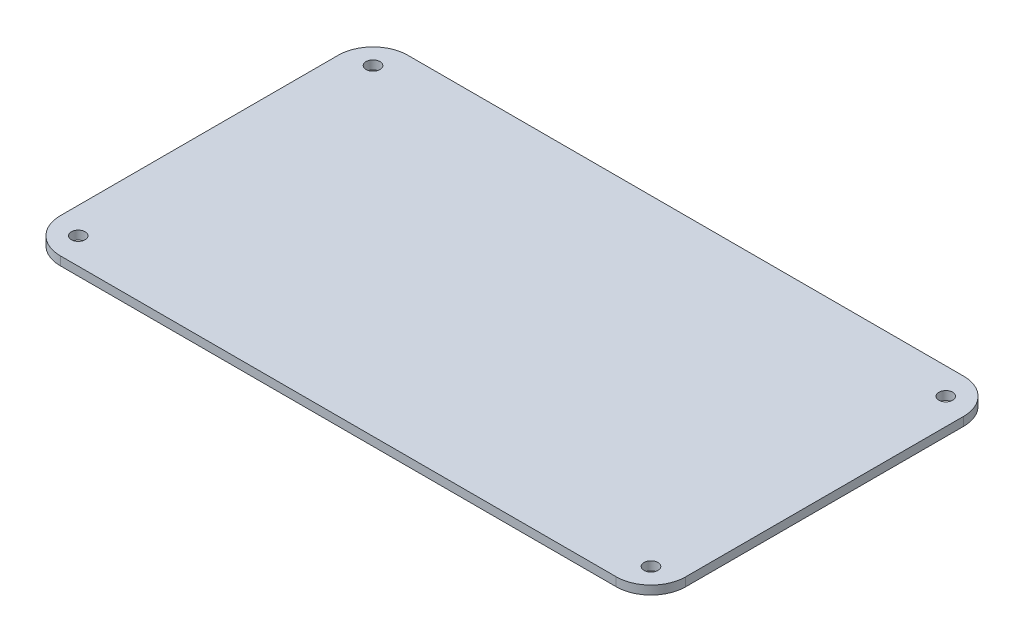
ISO-10303-21;
HEADER;
FILE_DESCRIPTION(('STEP AP214'),'2;1');
FILE_NAME('part.step','',(''),(''),'','','');
FILE_SCHEMA(('AUTOMOTIVE_DESIGN { 1 0 10303 214 1 1 1 1 }'));
ENDSEC;
DATA;
#1=APPLICATION_CONTEXT('core data for automotive mechanical design processes');
#2=APPLICATION_PROTOCOL_DEFINITION('international standard','automotive_design',2000,#1);
#3=PRODUCT_CONTEXT('',#1,'mechanical');
#4=PRODUCT('Part','Part','',(#3));
#5=PRODUCT_RELATED_PRODUCT_CATEGORY('part','',(#4));
#6=PRODUCT_DEFINITION_FORMATION('','',#4);
#7=PRODUCT_DEFINITION_CONTEXT('part definition',#1,'design');
#8=PRODUCT_DEFINITION('design','',#6,#7);
#9=PRODUCT_DEFINITION_SHAPE('','',#8);
#10=(LENGTH_UNIT() NAMED_UNIT(*) SI_UNIT(.MILLI.,.METRE.));
#11=(NAMED_UNIT(*) PLANE_ANGLE_UNIT() SI_UNIT($,.RADIAN.));
#12=(NAMED_UNIT(*) SI_UNIT($,.STERADIAN.) SOLID_ANGLE_UNIT());
#13=UNCERTAINTY_MEASURE_WITH_UNIT(LENGTH_MEASURE(1.E-05),#10,'distance_accuracy_value','');
#14=(GEOMETRIC_REPRESENTATION_CONTEXT(3) GLOBAL_UNCERTAINTY_ASSIGNED_CONTEXT((#13)) GLOBAL_UNIT_ASSIGNED_CONTEXT((#10,
#11,#12)) REPRESENTATION_CONTEXT('',''));
#15=CARTESIAN_POINT('',(0.,0.,0.));
#16=DIRECTION('',(0.,0.,1.));
#17=DIRECTION('',(1.,0.,0.));
#18=AXIS2_PLACEMENT_3D('',#15,#16,#17);
#19=CARTESIAN_POINT('',(-101.6,3.175,50.8));
#20=DIRECTION('',(0.,-1.,0.));
#21=DIRECTION('',(0.,0.,-1.));
#22=AXIS2_PLACEMENT_3D('',#19,#20,#21);
#23=PLANE('',#22);
#24=CARTESIAN_POINT('',(-101.6,3.175,50.8));
#25=DIRECTION('',(0.,1.,0.));
#26=DIRECTION('',(0.,0.,-1.));
#27=AXIS2_PLACEMENT_3D('',#24,#25,#26);
#28=CIRCLE('',#27,12.7);
#29=CARTESIAN_POINT('',(-114.3,3.175,50.7999999999999));
#30=VERTEX_POINT('',#29);
#31=CARTESIAN_POINT('',(-101.6,3.175,63.5));
#32=VERTEX_POINT('',#31);
#33=EDGE_CURVE('E145',#30,#32,#28,.T.);
#34=ORIENTED_EDGE('',*,*,#33,.T.);
#35=DIRECTION('',(1.,0.,0.));
#36=VECTOR('',#35,1.);
#37=CARTESIAN_POINT('',(101.6,3.175,63.5));
#38=LINE('',#37,#36);
#39=CARTESIAN_POINT('',(101.6,3.175,63.5));
#40=VERTEX_POINT('',#39);
#41=EDGE_CURVE('E93',#32,#40,#38,.T.);
#42=ORIENTED_EDGE('',*,*,#41,.T.);
#43=CARTESIAN_POINT('',(101.6,3.175,50.8));
#44=DIRECTION('',(0.,1.,0.));
#45=DIRECTION('',(0.,0.,1.));
#46=AXIS2_PLACEMENT_3D('',#43,#44,#45);
#47=CIRCLE('',#46,12.7);
#48=CARTESIAN_POINT('',(114.3,3.175,50.7999999999999));
#49=VERTEX_POINT('',#48);
#50=EDGE_CURVE('E160',#40,#49,#47,.T.);
#51=ORIENTED_EDGE('',*,*,#50,.T.);
#52=DIRECTION('',(0.,0.,-1.));
#53=VECTOR('',#52,1.);
#54=CARTESIAN_POINT('',(114.3,3.175,50.7999999999999));
#55=LINE('',#54,#53);
#56=CARTESIAN_POINT('',(114.3,3.175,-50.7999999999999));
#57=VERTEX_POINT('',#56);
#58=EDGE_CURVE('E173',#49,#57,#55,.T.);
#59=ORIENTED_EDGE('',*,*,#58,.T.);
#60=CARTESIAN_POINT('',(101.6,3.175,-50.8));
#61=DIRECTION('',(0.,1.,0.));
#62=DIRECTION('',(0.,0.,1.));
#63=AXIS2_PLACEMENT_3D('',#60,#61,#62);
#64=CIRCLE('',#63,12.7);
#65=CARTESIAN_POINT('',(101.6,3.175,-63.5));
#66=VERTEX_POINT('',#65);
#67=EDGE_CURVE('E112',#57,#66,#64,.T.);
#68=ORIENTED_EDGE('',*,*,#67,.T.);
#69=DIRECTION('',(-1.,0.,0.));
#70=VECTOR('',#69,1.);
#71=CARTESIAN_POINT('',(101.6,3.175,-63.5));
#72=LINE('',#71,#70);
#73=CARTESIAN_POINT('',(-101.6,3.175,-63.5));
#74=VERTEX_POINT('',#73);
#75=EDGE_CURVE('E106',#66,#74,#72,.T.);
#76=ORIENTED_EDGE('',*,*,#75,.T.);
#77=CARTESIAN_POINT('',(-101.6,3.175,-50.8));
#78=DIRECTION('',(0.,1.,0.));
#79=DIRECTION('',(0.,0.,1.));
#80=AXIS2_PLACEMENT_3D('',#77,#78,#79);
#81=CIRCLE('',#80,12.7);
#82=CARTESIAN_POINT('',(-114.3,3.175,-50.7999999999999));
#83=VERTEX_POINT('',#82);
#84=EDGE_CURVE('E110',#74,#83,#81,.T.);
#85=ORIENTED_EDGE('',*,*,#84,.T.);
#86=DIRECTION('',(0.,0.,1.));
#87=VECTOR('',#86,1.);
#88=CARTESIAN_POINT('',(-114.3,3.175,50.7999999999999));
#89=LINE('',#88,#87);
#90=EDGE_CURVE('E50',#83,#30,#89,.T.);
#91=ORIENTED_EDGE('',*,*,#90,.T.);
#92=EDGE_LOOP('',(#34,#42,#51,#59,#68,#76,#85,#91));
#93=FACE_BOUND('',#92,.T.);
#94=CARTESIAN_POINT('',(-104.6734,3.175,-53.8734));
#95=DIRECTION('',(0.,1.,0.));
#96=DIRECTION('',(0.,0.,1.));
#97=AXIS2_PLACEMENT_3D('',#94,#95,#96);
#98=CIRCLE('',#97,2.54);
#99=CARTESIAN_POINT('',(-104.6734,3.175,-51.3334));
#100=VERTEX_POINT('',#99);
#101=EDGE_CURVE('E134',#100,#100,#98,.T.);
#102=ORIENTED_EDGE('',*,*,#101,.F.);
#103=EDGE_LOOP('',(#102));
#104=FACE_BOUND('',#103,.T.);
#105=CARTESIAN_POINT('',(104.6734,3.175,-53.8734));
#106=DIRECTION('',(0.,1.,0.));
#107=DIRECTION('',(0.,0.,-1.));
#108=AXIS2_PLACEMENT_3D('',#105,#106,#107);
#109=CIRCLE('',#108,2.54);
#110=CARTESIAN_POINT('',(104.6734,3.175,-56.4134));
#111=VERTEX_POINT('',#110);
#112=EDGE_CURVE('E182',#111,#111,#109,.T.);
#113=ORIENTED_EDGE('',*,*,#112,.F.);
#114=EDGE_LOOP('',(#113));
#115=FACE_BOUND('',#114,.T.);
#116=CARTESIAN_POINT('',(104.6734,3.175,53.8734));
#117=DIRECTION('',(0.,1.,0.));
#118=DIRECTION('',(0.,0.,1.));
#119=AXIS2_PLACEMENT_3D('',#116,#117,#118);
#120=CIRCLE('',#119,2.54);
#121=CARTESIAN_POINT('',(104.6734,3.175,56.4134));
#122=VERTEX_POINT('',#121);
#123=EDGE_CURVE('E188',#122,#122,#120,.T.);
#124=ORIENTED_EDGE('',*,*,#123,.F.);
#125=EDGE_LOOP('',(#124));
#126=FACE_BOUND('',#125,.T.);
#127=CARTESIAN_POINT('',(-104.6734,3.175,53.8734));
#128=DIRECTION('',(0.,1.,0.));
#129=DIRECTION('',(0.,0.,-1.));
#130=AXIS2_PLACEMENT_3D('',#127,#128,#129);
#131=CIRCLE('',#130,2.54);
#132=CARTESIAN_POINT('',(-104.6734,3.175,51.3334));
#133=VERTEX_POINT('',#132);
#134=EDGE_CURVE('E194',#133,#133,#131,.T.);
#135=ORIENTED_EDGE('',*,*,#134,.F.);
#136=EDGE_LOOP('',(#135));
#137=FACE_BOUND('',#136,.T.);
#138=ADVANCED_FACE('F33',(#93,#104,#115,#126,#137),#23,.F.);
#139=CARTESIAN_POINT('',(-101.6,0.,50.8));
#140=DIRECTION('',(0.,-1.,0.));
#141=DIRECTION('',(0.,0.,-1.));
#142=AXIS2_PLACEMENT_3D('',#139,#140,#141);
#143=PLANE('',#142);
#144=CARTESIAN_POINT('',(104.6734,0.,53.8734));
#145=DIRECTION('',(0.,1.,0.));
#146=DIRECTION('',(0.,0.,1.));
#147=AXIS2_PLACEMENT_3D('',#144,#145,#146);
#148=CIRCLE('',#147,2.54);
#149=CARTESIAN_POINT('',(104.6734,0.,56.4134));
#150=VERTEX_POINT('',#149);
#151=EDGE_CURVE('E191',#150,#150,#148,.T.);
#152=ORIENTED_EDGE('',*,*,#151,.T.);
#153=EDGE_LOOP('',(#152));
#154=FACE_BOUND('',#153,.T.);
#155=CARTESIAN_POINT('',(-104.6734,0.,-53.8734));
#156=DIRECTION('',(0.,1.,0.));
#157=DIRECTION('',(0.,0.,1.));
#158=AXIS2_PLACEMENT_3D('',#155,#156,#157);
#159=CIRCLE('',#158,2.54);
#160=CARTESIAN_POINT('',(-104.6734,0.,-51.3334));
#161=VERTEX_POINT('',#160);
#162=EDGE_CURVE('E179',#161,#161,#159,.T.);
#163=ORIENTED_EDGE('',*,*,#162,.T.);
#164=EDGE_LOOP('',(#163));
#165=FACE_BOUND('',#164,.T.);
#166=CARTESIAN_POINT('',(-101.6,0.,50.8));
#167=DIRECTION('',(0.,1.,0.));
#168=DIRECTION('',(0.,0.,-1.));
#169=AXIS2_PLACEMENT_3D('',#166,#167,#168);
#170=CIRCLE('',#169,12.7);
#171=CARTESIAN_POINT('',(-114.3,0.,50.7999999999999));
#172=VERTEX_POINT('',#171);
#173=CARTESIAN_POINT('',(-101.6,0.,63.5));
#174=VERTEX_POINT('',#173);
#175=EDGE_CURVE('E130',#172,#174,#170,.T.);
#176=ORIENTED_EDGE('',*,*,#175,.F.);
#177=DIRECTION('',(0.,0.,1.));
#178=VECTOR('',#177,1.);
#179=CARTESIAN_POINT('',(-114.3,0.,50.7999999999999));
#180=LINE('',#179,#178);
#181=CARTESIAN_POINT('',(-114.3,0.,-50.7999999999999));
#182=VERTEX_POINT('',#181);
#183=EDGE_CURVE('E85',#182,#172,#180,.T.);
#184=ORIENTED_EDGE('',*,*,#183,.F.);
#185=CARTESIAN_POINT('',(-101.6,0.,-50.8));
#186=DIRECTION('',(0.,1.,0.));
#187=DIRECTION('',(0.,0.,1.));
#188=AXIS2_PLACEMENT_3D('',#185,#186,#187);
#189=CIRCLE('',#188,12.7);
#190=CARTESIAN_POINT('',(-101.6,0.,-63.5));
#191=VERTEX_POINT('',#190);
#192=EDGE_CURVE('E79',#191,#182,#189,.T.);
#193=ORIENTED_EDGE('',*,*,#192,.F.);
#194=DIRECTION('',(-1.,0.,0.));
#195=VECTOR('',#194,1.);
#196=CARTESIAN_POINT('',(101.6,0.,-63.5));
#197=LINE('',#196,#195);
#198=CARTESIAN_POINT('',(101.6,0.,-63.5));
#199=VERTEX_POINT('',#198);
#200=EDGE_CURVE('E120',#199,#191,#197,.T.);
#201=ORIENTED_EDGE('',*,*,#200,.F.);
#202=CARTESIAN_POINT('',(101.6,0.,-50.8));
#203=DIRECTION('',(0.,1.,0.));
#204=DIRECTION('',(0.,0.,1.));
#205=AXIS2_PLACEMENT_3D('',#202,#203,#204);
#206=CIRCLE('',#205,12.7);
#207=CARTESIAN_POINT('',(114.3,0.,-50.7999999999999));
#208=VERTEX_POINT('',#207);
#209=EDGE_CURVE('E140',#208,#199,#206,.T.);
#210=ORIENTED_EDGE('',*,*,#209,.F.);
#211=DIRECTION('',(0.,0.,-1.));
#212=VECTOR('',#211,1.);
#213=CARTESIAN_POINT('',(114.3,0.,50.7999999999999));
#214=LINE('',#213,#212);
#215=CARTESIAN_POINT('',(114.3,0.,50.7999999999999));
#216=VERTEX_POINT('',#215);
#217=EDGE_CURVE('E138',#216,#208,#214,.T.);
#218=ORIENTED_EDGE('',*,*,#217,.F.);
#219=CARTESIAN_POINT('',(101.6,0.,50.8));
#220=DIRECTION('',(0.,1.,0.));
#221=DIRECTION('',(0.,0.,1.));
#222=AXIS2_PLACEMENT_3D('',#219,#220,#221);
#223=CIRCLE('',#222,12.7);
#224=CARTESIAN_POINT('',(101.6,0.,63.5));
#225=VERTEX_POINT('',#224);
#226=EDGE_CURVE('E136',#225,#216,#223,.T.);
#227=ORIENTED_EDGE('',*,*,#226,.F.);
#228=DIRECTION('',(1.,0.,0.));
#229=VECTOR('',#228,1.);
#230=CARTESIAN_POINT('',(101.6,0.,63.5));
#231=LINE('',#230,#229);
#232=EDGE_CURVE('E133',#174,#225,#231,.T.);
#233=ORIENTED_EDGE('',*,*,#232,.F.);
#234=EDGE_LOOP('',(#176,#184,#193,#201,#210,#218,#227,#233));
#235=FACE_BOUND('',#234,.T.);
#236=CARTESIAN_POINT('',(104.6734,0.,-53.8734));
#237=DIRECTION('',(0.,1.,0.));
#238=DIRECTION('',(0.,0.,-1.));
#239=AXIS2_PLACEMENT_3D('',#236,#237,#238);
#240=CIRCLE('',#239,2.54);
#241=CARTESIAN_POINT('',(104.6734,0.,-56.4134));
#242=VERTEX_POINT('',#241);
#243=EDGE_CURVE('E185',#242,#242,#240,.T.);
#244=ORIENTED_EDGE('',*,*,#243,.T.);
#245=EDGE_LOOP('',(#244));
#246=FACE_BOUND('',#245,.T.);
#247=CARTESIAN_POINT('',(-104.6734,0.,53.8734));
#248=DIRECTION('',(0.,1.,0.));
#249=DIRECTION('',(0.,0.,-1.));
#250=AXIS2_PLACEMENT_3D('',#247,#248,#249);
#251=CIRCLE('',#250,2.54);
#252=CARTESIAN_POINT('',(-104.6734,0.,51.3334));
#253=VERTEX_POINT('',#252);
#254=EDGE_CURVE('E197',#253,#253,#251,.T.);
#255=ORIENTED_EDGE('',*,*,#254,.T.);
#256=EDGE_LOOP('',(#255));
#257=FACE_BOUND('',#256,.T.);
#258=ADVANCED_FACE('F164',(#154,#165,#235,#246,#257),#143,.T.);
#259=CARTESIAN_POINT('',(-101.6,3.175,50.8));
#260=DIRECTION('',(0.,-1.,0.));
#261=DIRECTION('',(0.,0.,-1.));
#262=AXIS2_PLACEMENT_3D('',#259,#260,#261);
#263=CYLINDRICAL_SURFACE('',#262,12.7);
#264=ORIENTED_EDGE('',*,*,#175,.T.);
#265=DIRECTION('',(0.,-1.,0.));
#266=VECTOR('',#265,1.);
#267=CARTESIAN_POINT('',(-101.6,3.175,63.5));
#268=LINE('',#267,#266);
#269=EDGE_CURVE('E11',#32,#174,#268,.T.);
#270=ORIENTED_EDGE('',*,*,#269,.F.);
#271=ORIENTED_EDGE('',*,*,#33,.F.);
#272=DIRECTION('',(0.,-1.,0.));
#273=VECTOR('',#272,1.);
#274=CARTESIAN_POINT('',(-114.3,3.175,50.7999999999999));
#275=LINE('',#274,#273);
#276=EDGE_CURVE('E126',#30,#172,#275,.T.);
#277=ORIENTED_EDGE('',*,*,#276,.T.);
#278=EDGE_LOOP('',(#264,#270,#271,#277));
#279=FACE_BOUND('',#278,.T.);
#280=ADVANCED_FACE('F35',(#279),#263,.T.);
#281=CARTESIAN_POINT('',(101.6,3.175,63.5));
#282=DIRECTION('',(0.,0.,-1.));
#283=DIRECTION('',(-1.,0.,0.));
#284=AXIS2_PLACEMENT_3D('',#281,#282,#283);
#285=PLANE('',#284);
#286=ORIENTED_EDGE('',*,*,#232,.T.);
#287=DIRECTION('',(0.,-1.,0.));
#288=VECTOR('',#287,1.);
#289=CARTESIAN_POINT('',(101.6,3.175,63.5));
#290=LINE('',#289,#288);
#291=EDGE_CURVE('E42',#40,#225,#290,.T.);
#292=ORIENTED_EDGE('',*,*,#291,.F.);
#293=ORIENTED_EDGE('',*,*,#41,.F.);
#294=ORIENTED_EDGE('',*,*,#269,.T.);
#295=EDGE_LOOP('',(#286,#292,#293,#294));
#296=FACE_BOUND('',#295,.T.);
#297=ADVANCED_FACE('F229',(#296),#285,.F.);
#298=CARTESIAN_POINT('',(101.6,3.175,50.8));
#299=DIRECTION('',(0.,-1.,0.));
#300=DIRECTION('',(0.,0.,-1.));
#301=AXIS2_PLACEMENT_3D('',#298,#299,#300);
#302=CYLINDRICAL_SURFACE('',#301,12.7);
#303=ORIENTED_EDGE('',*,*,#226,.T.);
#304=DIRECTION('',(0.,-1.,0.));
#305=VECTOR('',#304,1.);
#306=CARTESIAN_POINT('',(114.3,3.175,50.7999999999999));
#307=LINE('',#306,#305);
#308=EDGE_CURVE('E152',#49,#216,#307,.T.);
#309=ORIENTED_EDGE('',*,*,#308,.F.);
#310=ORIENTED_EDGE('',*,*,#50,.F.);
#311=ORIENTED_EDGE('',*,*,#291,.T.);
#312=EDGE_LOOP('',(#303,#309,#310,#311));
#313=FACE_BOUND('',#312,.T.);
#314=ADVANCED_FACE('F158',(#313),#302,.T.);
#315=CARTESIAN_POINT('',(114.3,3.175,50.7999999999999));
#316=DIRECTION('',(-1.,0.,0.));
#317=DIRECTION('',(0.,0.,1.));
#318=AXIS2_PLACEMENT_3D('',#315,#316,#317);
#319=PLANE('',#318);
#320=ORIENTED_EDGE('',*,*,#217,.T.);
#321=DIRECTION('',(0.,-1.,0.));
#322=VECTOR('',#321,1.);
#323=CARTESIAN_POINT('',(114.3,3.175,-50.7999999999999));
#324=LINE('',#323,#322);
#325=EDGE_CURVE('E149',#57,#208,#324,.T.);
#326=ORIENTED_EDGE('',*,*,#325,.F.);
#327=ORIENTED_EDGE('',*,*,#58,.F.);
#328=ORIENTED_EDGE('',*,*,#308,.T.);
#329=EDGE_LOOP('',(#320,#326,#327,#328));
#330=FACE_BOUND('',#329,.T.);
#331=ADVANCED_FACE('F169',(#330),#319,.F.);
#332=CARTESIAN_POINT('',(101.6,3.175,-50.8));
#333=DIRECTION('',(0.,-1.,0.));
#334=DIRECTION('',(0.,0.,-1.));
#335=AXIS2_PLACEMENT_3D('',#332,#333,#334);
#336=CYLINDRICAL_SURFACE('',#335,12.7);
#337=ORIENTED_EDGE('',*,*,#209,.T.);
#338=DIRECTION('',(0.,-1.,0.));
#339=VECTOR('',#338,1.);
#340=CARTESIAN_POINT('',(101.6,3.175,-63.5));
#341=LINE('',#340,#339);
#342=EDGE_CURVE('E121',#66,#199,#341,.T.);
#343=ORIENTED_EDGE('',*,*,#342,.F.);
#344=ORIENTED_EDGE('',*,*,#67,.F.);
#345=ORIENTED_EDGE('',*,*,#325,.T.);
#346=EDGE_LOOP('',(#337,#343,#344,#345));
#347=FACE_BOUND('',#346,.T.);
#348=ADVANCED_FACE('F172',(#347),#336,.T.);
#349=CARTESIAN_POINT('',(101.6,3.175,-63.5));
#350=DIRECTION('',(0.,0.,1.));
#351=DIRECTION('',(1.,0.,0.));
#352=AXIS2_PLACEMENT_3D('',#349,#350,#351);
#353=PLANE('',#352);
#354=ORIENTED_EDGE('',*,*,#200,.T.);
#355=DIRECTION('',(0.,-1.,0.));
#356=VECTOR('',#355,1.);
#357=CARTESIAN_POINT('',(-101.6,3.175,-63.5));
#358=LINE('',#357,#356);
#359=EDGE_CURVE('E117',#74,#191,#358,.T.);
#360=ORIENTED_EDGE('',*,*,#359,.F.);
#361=ORIENTED_EDGE('',*,*,#75,.F.);
#362=ORIENTED_EDGE('',*,*,#342,.T.);
#363=EDGE_LOOP('',(#354,#360,#361,#362));
#364=FACE_BOUND('',#363,.T.);
#365=ADVANCED_FACE('F118',(#364),#353,.F.);
#366=CARTESIAN_POINT('',(-101.6,3.175,-50.8));
#367=DIRECTION('',(0.,-1.,0.));
#368=DIRECTION('',(0.,0.,-1.));
#369=AXIS2_PLACEMENT_3D('',#366,#367,#368);
#370=CYLINDRICAL_SURFACE('',#369,12.7);
#371=ORIENTED_EDGE('',*,*,#192,.T.);
#372=DIRECTION('',(0.,-1.,0.));
#373=VECTOR('',#372,1.);
#374=CARTESIAN_POINT('',(-114.3,3.175,-50.7999999999999));
#375=LINE('',#374,#373);
#376=EDGE_CURVE('E122',#83,#182,#375,.T.);
#377=ORIENTED_EDGE('',*,*,#376,.F.);
#378=ORIENTED_EDGE('',*,*,#84,.F.);
#379=ORIENTED_EDGE('',*,*,#359,.T.);
#380=EDGE_LOOP('',(#371,#377,#378,#379));
#381=FACE_BOUND('',#380,.T.);
#382=ADVANCED_FACE('F124',(#381),#370,.T.);
#383=CARTESIAN_POINT('',(-114.3,3.175,50.7999999999999));
#384=DIRECTION('',(1.,0.,0.));
#385=DIRECTION('',(0.,0.,-1.));
#386=AXIS2_PLACEMENT_3D('',#383,#384,#385);
#387=PLANE('',#386);
#388=ORIENTED_EDGE('',*,*,#183,.T.);
#389=ORIENTED_EDGE('',*,*,#276,.F.);
#390=ORIENTED_EDGE('',*,*,#90,.F.);
#391=ORIENTED_EDGE('',*,*,#376,.T.);
#392=EDGE_LOOP('',(#388,#389,#390,#391));
#393=FACE_BOUND('',#392,.T.);
#394=ADVANCED_FACE('F217',(#393),#387,.F.);
#395=CARTESIAN_POINT('',(-104.6734,3.175,-53.8734));
#396=DIRECTION('',(0.,-1.,0.));
#397=DIRECTION('',(0.,0.,-1.));
#398=AXIS2_PLACEMENT_3D('',#395,#396,#397);
#399=CYLINDRICAL_SURFACE('',#398,2.54);
#400=ORIENTED_EDGE('',*,*,#101,.T.);
#401=EDGE_LOOP('',(#400));
#402=FACE_BOUND('',#401,.T.);
#403=ORIENTED_EDGE('',*,*,#162,.F.);
#404=EDGE_LOOP('',(#403));
#405=FACE_BOUND('',#404,.T.);
#406=ADVANCED_FACE('F214',(#402,#405),#399,.F.);
#407=CARTESIAN_POINT('',(104.6734,3.175,-53.8734));
#408=DIRECTION('',(0.,-1.,0.));
#409=DIRECTION('',(0.,0.,-1.));
#410=AXIS2_PLACEMENT_3D('',#407,#408,#409);
#411=CYLINDRICAL_SURFACE('',#410,2.54);
#412=ORIENTED_EDGE('',*,*,#112,.T.);
#413=EDGE_LOOP('',(#412));
#414=FACE_BOUND('',#413,.T.);
#415=ORIENTED_EDGE('',*,*,#243,.F.);
#416=EDGE_LOOP('',(#415));
#417=FACE_BOUND('',#416,.T.);
#418=ADVANCED_FACE('F293',(#414,#417),#411,.F.);
#419=CARTESIAN_POINT('',(104.6734,3.175,53.8734));
#420=DIRECTION('',(0.,-1.,0.));
#421=DIRECTION('',(0.,0.,-1.));
#422=AXIS2_PLACEMENT_3D('',#419,#420,#421);
#423=CYLINDRICAL_SURFACE('',#422,2.54);
#424=ORIENTED_EDGE('',*,*,#123,.T.);
#425=EDGE_LOOP('',(#424));
#426=FACE_BOUND('',#425,.T.);
#427=ORIENTED_EDGE('',*,*,#151,.F.);
#428=EDGE_LOOP('',(#427));
#429=FACE_BOUND('',#428,.T.);
#430=ADVANCED_FACE('F301',(#426,#429),#423,.F.);
#431=CARTESIAN_POINT('',(-104.6734,3.175,53.8734));
#432=DIRECTION('',(0.,-1.,0.));
#433=DIRECTION('',(0.,0.,-1.));
#434=AXIS2_PLACEMENT_3D('',#431,#432,#433);
#435=CYLINDRICAL_SURFACE('',#434,2.54);
#436=ORIENTED_EDGE('',*,*,#134,.T.);
#437=EDGE_LOOP('',(#436));
#438=FACE_BOUND('',#437,.T.);
#439=ORIENTED_EDGE('',*,*,#254,.F.);
#440=EDGE_LOOP('',(#439));
#441=FACE_BOUND('',#440,.T.);
#442=ADVANCED_FACE('F203',(#438,#441),#435,.F.);
#443=CLOSED_SHELL('',(#138,#258,#280,#297,#314,#331,#348,#365,#382,#394,#406,#418,#430,#442));
#444=MANIFOLD_SOLID_BREP('B2',#443);
#445=ADVANCED_BREP_SHAPE_REPRESENTATION('',(#18,#444),#14);
#446=SHAPE_DEFINITION_REPRESENTATION(#9,#445);
ENDSEC;
END-ISO-10303-21;
